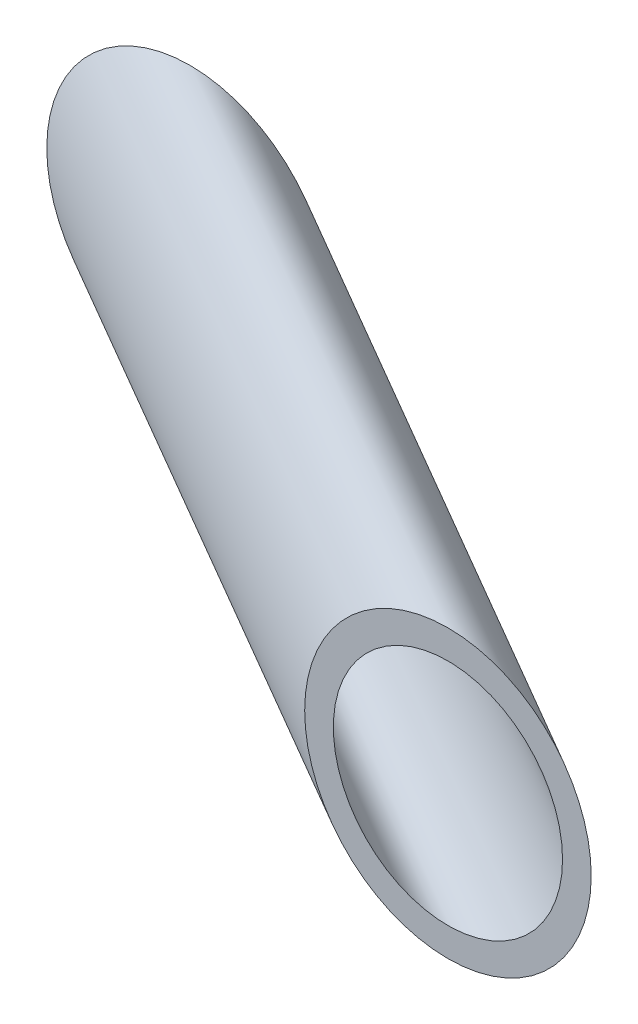
ISO-10303-21;
HEADER;
FILE_DESCRIPTION(('STEP AP214'),'2;1');
FILE_NAME('part.step','',(''),(''),'','','');
FILE_SCHEMA(('AUTOMOTIVE_DESIGN { 1 0 10303 214 1 1 1 1 }'));
ENDSEC;
DATA;
#1=APPLICATION_CONTEXT('core data for automotive mechanical design processes');
#2=APPLICATION_PROTOCOL_DEFINITION('international standard','automotive_design',2000,#1);
#3=PRODUCT_CONTEXT('',#1,'mechanical');
#4=PRODUCT('Part','Part','',(#3));
#5=PRODUCT_RELATED_PRODUCT_CATEGORY('part','',(#4));
#6=PRODUCT_DEFINITION_FORMATION('','',#4);
#7=PRODUCT_DEFINITION_CONTEXT('part definition',#1,'design');
#8=PRODUCT_DEFINITION('design','',#6,#7);
#9=PRODUCT_DEFINITION_SHAPE('','',#8);
#10=(LENGTH_UNIT() NAMED_UNIT(*) SI_UNIT(.MILLI.,.METRE.));
#11=(NAMED_UNIT(*) PLANE_ANGLE_UNIT() SI_UNIT($,.RADIAN.));
#12=(NAMED_UNIT(*) SI_UNIT($,.STERADIAN.) SOLID_ANGLE_UNIT());
#13=UNCERTAINTY_MEASURE_WITH_UNIT(LENGTH_MEASURE(1.E-05),#10,'distance_accuracy_value','');
#14=(GEOMETRIC_REPRESENTATION_CONTEXT(3) GLOBAL_UNCERTAINTY_ASSIGNED_CONTEXT((#13)) GLOBAL_UNIT_ASSIGNED_CONTEXT((#10,
#11,#12)) REPRESENTATION_CONTEXT('',''));
#15=CARTESIAN_POINT('',(0.,0.,0.));
#16=DIRECTION('',(0.,0.,1.));
#17=DIRECTION('',(1.,0.,0.));
#18=AXIS2_PLACEMENT_3D('',#15,#16,#17);
#19=CARTESIAN_POINT('',(54.61,0.,31.75));
#20=DIRECTION('',(0.,0.,1.));
#21=DIRECTION('',(1.,0.,0.));
#22=AXIS2_PLACEMENT_3D('',#19,#20,#21);
#23=CIRCLE('',#22,10.16);
#24=DIRECTION('',(-0.864507186684193,0.,-0.502620457374531));
#25=VECTOR('',#24,1.);
#26=SURFACE_OF_LINEAR_EXTRUSION('',#23,#25);
#27=CARTESIAN_POINT('',(64.77,0.,31.75));
#28=VERTEX_POINT('',#27);
#29=EDGE_CURVE('E41',#28,#28,#23,.T.);
#30=ORIENTED_EDGE('',*,*,#29,.T.);
#31=EDGE_LOOP('',(#30));
#32=FACE_BOUND('',#31,.T.);
#33=CARTESIAN_POINT('',(0.,0.,0.));
#34=DIRECTION('',(0.,0.,1.));
#35=DIRECTION('',(1.,0.,0.));
#36=AXIS2_PLACEMENT_3D('',#33,#34,#35);
#37=CIRCLE('',#36,10.16);
#38=CARTESIAN_POINT('',(10.16,0.,0.));
#39=VERTEX_POINT('',#38);
#40=EDGE_CURVE('E48',#39,#39,#37,.T.);
#41=ORIENTED_EDGE('',*,*,#40,.F.);
#42=EDGE_LOOP('',(#41));
#43=FACE_BOUND('',#42,.T.);
#44=ADVANCED_FACE('F33',(#32,#43),#26,.T.);
#45=CARTESIAN_POINT('',(54.61,0.,31.75));
#46=DIRECTION('',(0.,0.,1.));
#47=DIRECTION('',(1.,0.,0.));
#48=AXIS2_PLACEMENT_3D('',#45,#46,#47);
#49=CIRCLE('',#48,12.7);
#50=DIRECTION('',(-0.864507186684193,0.,-0.502620457374531));
#51=VECTOR('',#50,1.);
#52=SURFACE_OF_LINEAR_EXTRUSION('',#49,#51);
#53=CARTESIAN_POINT('',(67.31,0.,31.75));
#54=VERTEX_POINT('',#53);
#55=EDGE_CURVE('E10',#54,#54,#49,.T.);
#56=ORIENTED_EDGE('',*,*,#55,.F.);
#57=EDGE_LOOP('',(#56));
#58=FACE_BOUND('',#57,.T.);
#59=CARTESIAN_POINT('',(0.,0.,0.));
#60=DIRECTION('',(0.,0.,1.));
#61=DIRECTION('',(1.,0.,0.));
#62=AXIS2_PLACEMENT_3D('',#59,#60,#61);
#63=CIRCLE('',#62,12.7);
#64=CARTESIAN_POINT('',(12.7,0.,0.));
#65=VERTEX_POINT('',#64);
#66=EDGE_CURVE('E37',#65,#65,#63,.T.);
#67=ORIENTED_EDGE('',*,*,#66,.T.);
#68=EDGE_LOOP('',(#67));
#69=FACE_BOUND('',#68,.T.);
#70=ADVANCED_FACE('F49',(#58,#69),#52,.F.);
#71=CARTESIAN_POINT('',(54.61,0.,31.75));
#72=DIRECTION('',(0.,0.,1.));
#73=DIRECTION('',(1.,0.,0.));
#74=AXIS2_PLACEMENT_3D('',#71,#72,#73);
#75=PLANE('',#74);
#76=ORIENTED_EDGE('',*,*,#29,.F.);
#77=EDGE_LOOP('',(#76));
#78=FACE_BOUND('',#77,.T.);
#79=ORIENTED_EDGE('',*,*,#55,.T.);
#80=EDGE_LOOP('',(#79));
#81=FACE_BOUND('',#80,.T.);
#82=ADVANCED_FACE('F52',(#78,#81),#75,.T.);
#83=CARTESIAN_POINT('',(0.,0.,0.));
#84=DIRECTION('',(0.,0.,1.));
#85=DIRECTION('',(1.,0.,0.));
#86=AXIS2_PLACEMENT_3D('',#83,#84,#85);
#87=PLANE('',#86);
#88=ORIENTED_EDGE('',*,*,#40,.T.);
#89=EDGE_LOOP('',(#88));
#90=FACE_BOUND('',#89,.T.);
#91=ORIENTED_EDGE('',*,*,#66,.F.);
#92=EDGE_LOOP('',(#91));
#93=FACE_BOUND('',#92,.T.);
#94=ADVANCED_FACE('F54',(#90,#93),#87,.F.);
#95=CLOSED_SHELL('',(#44,#70,#82,#94));
#96=MANIFOLD_SOLID_BREP('B2',#95);
#97=ADVANCED_BREP_SHAPE_REPRESENTATION('',(#18,#96),#14);
#98=SHAPE_DEFINITION_REPRESENTATION(#9,#97);
ENDSEC;
END-ISO-10303-21;
